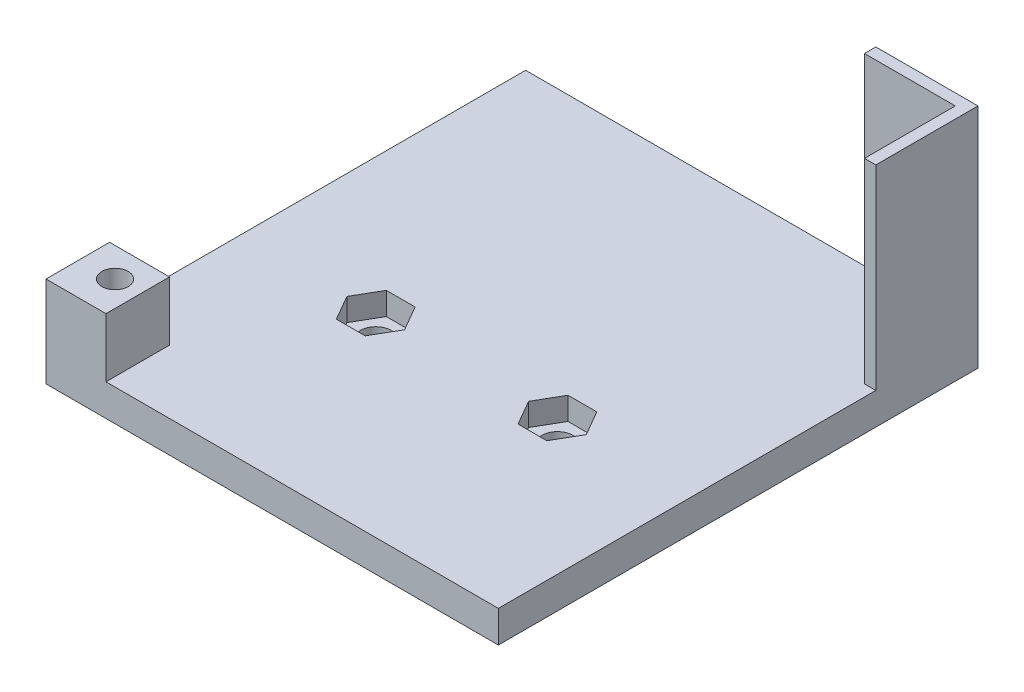
ISO-10303-21;
HEADER;
FILE_DESCRIPTION(('STEP AP214'),'2;1');
FILE_NAME('part.step','',(''),(''),'','','');
FILE_SCHEMA(('AUTOMOTIVE_DESIGN { 1 0 10303 214 1 1 1 1 }'));
ENDSEC;
DATA;
#1=APPLICATION_CONTEXT('core data for automotive mechanical design processes');
#2=APPLICATION_PROTOCOL_DEFINITION('international standard','automotive_design',2000,#1);
#3=PRODUCT_CONTEXT('',#1,'mechanical');
#4=PRODUCT('Part','Part','',(#3));
#5=PRODUCT_RELATED_PRODUCT_CATEGORY('part','',(#4));
#6=PRODUCT_DEFINITION_FORMATION('','',#4);
#7=PRODUCT_DEFINITION_CONTEXT('part definition',#1,'design');
#8=PRODUCT_DEFINITION('design','',#6,#7);
#9=PRODUCT_DEFINITION_SHAPE('','',#8);
#10=(LENGTH_UNIT() NAMED_UNIT(*) SI_UNIT(.MILLI.,.METRE.));
#11=(NAMED_UNIT(*) PLANE_ANGLE_UNIT() SI_UNIT($,.RADIAN.));
#12=(NAMED_UNIT(*) SI_UNIT($,.STERADIAN.) SOLID_ANGLE_UNIT());
#13=UNCERTAINTY_MEASURE_WITH_UNIT(LENGTH_MEASURE(1.E-05),#10,'distance_accuracy_value','');
#14=(GEOMETRIC_REPRESENTATION_CONTEXT(3) GLOBAL_UNCERTAINTY_ASSIGNED_CONTEXT((#13)) GLOBAL_UNIT_ASSIGNED_CONTEXT((#10,
#11,#12)) REPRESENTATION_CONTEXT('',''));
#15=CARTESIAN_POINT('',(0.,0.,0.));
#16=DIRECTION('',(0.,0.,1.));
#17=DIRECTION('',(1.,0.,0.));
#18=AXIS2_PLACEMENT_3D('',#15,#16,#17);
#19=CARTESIAN_POINT('',(10.,0.,5.));
#20=DIRECTION('',(0.,1.,0.));
#21=DIRECTION('',(0.,0.,1.));
#22=AXIS2_PLACEMENT_3D('',#19,#20,#21);
#23=CYLINDRICAL_SURFACE('',#22,1.7);
#24=CARTESIAN_POINT('',(10.,0.,5.));
#25=DIRECTION('',(0.,1.,0.));
#26=DIRECTION('',(0.,0.,1.));
#27=AXIS2_PLACEMENT_3D('',#24,#25,#26);
#28=CIRCLE('',#27,1.7);
#29=CARTESIAN_POINT('',(10.,0.,6.7));
#30=VERTEX_POINT('',#29);
#31=EDGE_CURVE('E247',#30,#30,#28,.T.);
#32=ORIENTED_EDGE('',*,*,#31,.F.);
#33=EDGE_LOOP('',(#32));
#34=FACE_BOUND('',#33,.T.);
#35=CARTESIAN_POINT('',(10.,1.,5.));
#36=DIRECTION('',(0.,1.,0.));
#37=DIRECTION('',(0.,0.,1.));
#38=AXIS2_PLACEMENT_3D('',#35,#36,#37);
#39=CIRCLE('',#38,1.7);
#40=CARTESIAN_POINT('',(10.,1.,6.7));
#41=VERTEX_POINT('',#40);
#42=EDGE_CURVE('E255',#41,#41,#39,.T.);
#43=ORIENTED_EDGE('',*,*,#42,.T.);
#44=EDGE_LOOP('',(#43));
#45=FACE_BOUND('',#44,.T.);
#46=ADVANCED_FACE('F37',(#34,#45),#23,.F.);
#47=CARTESIAN_POINT('',(-10.,0.,5.));
#48=DIRECTION('',(0.,1.,0.));
#49=DIRECTION('',(0.,0.,1.));
#50=AXIS2_PLACEMENT_3D('',#47,#48,#49);
#51=CYLINDRICAL_SURFACE('',#50,1.7);
#52=CARTESIAN_POINT('',(-10.,0.,5.));
#53=DIRECTION('',(0.,1.,0.));
#54=DIRECTION('',(0.,0.,1.));
#55=AXIS2_PLACEMENT_3D('',#52,#53,#54);
#56=CIRCLE('',#55,1.7);
#57=CARTESIAN_POINT('',(-10.,0.,6.7));
#58=VERTEX_POINT('',#57);
#59=EDGE_CURVE('E304',#58,#58,#56,.T.);
#60=ORIENTED_EDGE('',*,*,#59,.F.);
#61=EDGE_LOOP('',(#60));
#62=FACE_BOUND('',#61,.T.);
#63=CARTESIAN_POINT('',(-10.,1.,5.));
#64=DIRECTION('',(0.,1.,0.));
#65=DIRECTION('',(0.,0.,1.));
#66=AXIS2_PLACEMENT_3D('',#63,#64,#65);
#67=CIRCLE('',#66,1.7);
#68=CARTESIAN_POINT('',(-10.,1.,6.7));
#69=VERTEX_POINT('',#68);
#70=EDGE_CURVE('E225',#69,#69,#67,.T.);
#71=ORIENTED_EDGE('',*,*,#70,.T.);
#72=EDGE_LOOP('',(#71));
#73=FACE_BOUND('',#72,.T.);
#74=ADVANCED_FACE('F465',(#62,#73),#51,.F.);
#75=CARTESIAN_POINT('',(0.,3.5,26.4));
#76=DIRECTION('',(0.,0.,-1.));
#77=DIRECTION('',(-1.,0.,0.));
#78=AXIS2_PLACEMENT_3D('',#75,#76,#77);
#79=PLANE('',#78);
#80=DIRECTION('',(1.,0.,0.));
#81=VECTOR('',#80,1.);
#82=CARTESIAN_POINT('',(0.,0.,26.4));
#83=LINE('',#82,#81);
#84=CARTESIAN_POINT('',(-24.9,0.,26.4));
#85=VERTEX_POINT('',#84);
#86=CARTESIAN_POINT('',(24.9,0.,26.4));
#87=VERTEX_POINT('',#86);
#88=EDGE_CURVE('E369',#85,#87,#83,.T.);
#89=ORIENTED_EDGE('',*,*,#88,.T.);
#90=DIRECTION('',(0.,-1.,0.));
#91=VECTOR('',#90,1.);
#92=CARTESIAN_POINT('',(24.9,3.5,26.4));
#93=LINE('',#92,#91);
#94=CARTESIAN_POINT('',(24.9,3.5,26.4));
#95=VERTEX_POINT('',#94);
#96=EDGE_CURVE('E11',#95,#87,#93,.T.);
#97=ORIENTED_EDGE('',*,*,#96,.F.);
#98=DIRECTION('',(1.,0.,0.));
#99=VECTOR('',#98,1.);
#100=CARTESIAN_POINT('',(0.,3.5,26.4));
#101=LINE('',#100,#99);
#102=CARTESIAN_POINT('',(-18.2977272727273,3.5,26.4));
#103=VERTEX_POINT('',#102);
#104=EDGE_CURVE('E373',#103,#95,#101,.T.);
#105=ORIENTED_EDGE('',*,*,#104,.F.);
#106=DIRECTION('',(0.,-1.,0.));
#107=VECTOR('',#106,1.);
#108=CARTESIAN_POINT('',(-18.2977272727273,10.,26.4));
#109=LINE('',#108,#107);
#110=CARTESIAN_POINT('',(-18.2977272727273,10.,26.4));
#111=VERTEX_POINT('',#110);
#112=EDGE_CURVE('E335',#111,#103,#109,.T.);
#113=ORIENTED_EDGE('',*,*,#112,.F.);
#114=DIRECTION('',(1.,0.,0.));
#115=VECTOR('',#114,1.);
#116=CARTESIAN_POINT('',(0.,10.,26.4));
#117=LINE('',#116,#115);
#118=CARTESIAN_POINT('',(-24.9,10.,26.4));
#119=VERTEX_POINT('',#118);
#120=EDGE_CURVE('E313',#119,#111,#117,.T.);
#121=ORIENTED_EDGE('',*,*,#120,.F.);
#122=DIRECTION('',(0.,-1.,0.));
#123=VECTOR('',#122,1.);
#124=CARTESIAN_POINT('',(-24.9,10.,26.4));
#125=LINE('',#124,#123);
#126=EDGE_CURVE('E326',#119,#85,#125,.T.);
#127=ORIENTED_EDGE('',*,*,#126,.T.);
#128=EDGE_LOOP('',(#89,#97,#105,#113,#121,#127));
#129=FACE_BOUND('',#128,.T.);
#130=ADVANCED_FACE('F39',(#129),#79,.F.);
#131=CARTESIAN_POINT('',(24.9,3.5,0.));
#132=DIRECTION('',(-1.,0.,0.));
#133=DIRECTION('',(0.,0.,1.));
#134=AXIS2_PLACEMENT_3D('',#131,#132,#133);
#135=PLANE('',#134);
#136=DIRECTION('',(0.,0.,-1.));
#137=VECTOR('',#136,1.);
#138=CARTESIAN_POINT('',(24.9,0.,0.));
#139=LINE('',#138,#137);
#140=CARTESIAN_POINT('',(24.9,0.,-26.4));
#141=VERTEX_POINT('',#140);
#142=EDGE_CURVE('E396',#87,#141,#139,.T.);
#143=ORIENTED_EDGE('',*,*,#142,.T.);
#144=DIRECTION('',(0.,-1.,0.));
#145=VECTOR('',#144,1.);
#146=CARTESIAN_POINT('',(24.9,25.,-26.4));
#147=LINE('',#146,#145);
#148=CARTESIAN_POINT('',(24.9,25.,-26.4));
#149=VERTEX_POINT('',#148);
#150=EDGE_CURVE('E360',#149,#141,#147,.T.);
#151=ORIENTED_EDGE('',*,*,#150,.F.);
#152=DIRECTION('',(0.,0.,-1.));
#153=VECTOR('',#152,1.);
#154=CARTESIAN_POINT('',(24.9,25.,0.));
#155=LINE('',#154,#153);
#156=CARTESIAN_POINT('',(24.9,25.,-15.15));
#157=VERTEX_POINT('',#156);
#158=EDGE_CURVE('E343',#157,#149,#155,.T.);
#159=ORIENTED_EDGE('',*,*,#158,.F.);
#160=DIRECTION('',(0.,-1.,0.));
#161=VECTOR('',#160,1.);
#162=CARTESIAN_POINT('',(24.9,25.,-15.15));
#163=LINE('',#162,#161);
#164=CARTESIAN_POINT('',(24.9,3.5,-15.15));
#165=VERTEX_POINT('',#164);
#166=EDGE_CURVE('E363',#157,#165,#163,.T.);
#167=ORIENTED_EDGE('',*,*,#166,.T.);
#168=DIRECTION('',(0.,0.,-1.));
#169=VECTOR('',#168,1.);
#170=CARTESIAN_POINT('',(24.9,3.5,0.));
#171=LINE('',#170,#169);
#172=EDGE_CURVE('E376',#95,#165,#171,.T.);
#173=ORIENTED_EDGE('',*,*,#172,.F.);
#174=ORIENTED_EDGE('',*,*,#96,.T.);
#175=EDGE_LOOP('',(#143,#151,#159,#167,#173,#174));
#176=FACE_BOUND('',#175,.T.);
#177=ADVANCED_FACE('F418',(#176),#135,.F.);
#178=CARTESIAN_POINT('',(0.,3.5,-26.4));
#179=DIRECTION('',(0.,0.,-1.));
#180=DIRECTION('',(-1.,0.,0.));
#181=AXIS2_PLACEMENT_3D('',#178,#179,#180);
#182=PLANE('',#181);
#183=DIRECTION('',(1.,0.,0.));
#184=VECTOR('',#183,1.);
#185=CARTESIAN_POINT('',(0.,0.,-26.4));
#186=LINE('',#185,#184);
#187=CARTESIAN_POINT('',(-24.9,0.,-26.4));
#188=VERTEX_POINT('',#187);
#189=EDGE_CURVE('E398',#188,#141,#186,.T.);
#190=ORIENTED_EDGE('',*,*,#189,.F.);
#191=DIRECTION('',(0.,-1.,0.));
#192=VECTOR('',#191,1.);
#193=CARTESIAN_POINT('',(-24.9,3.5,-26.4));
#194=LINE('',#193,#192);
#195=CARTESIAN_POINT('',(-24.9,3.5,-26.4));
#196=VERTEX_POINT('',#195);
#197=EDGE_CURVE('E45',#196,#188,#194,.T.);
#198=ORIENTED_EDGE('',*,*,#197,.F.);
#199=DIRECTION('',(1.,0.,0.));
#200=VECTOR('',#199,1.);
#201=CARTESIAN_POINT('',(0.,3.5,-26.4));
#202=LINE('',#201,#200);
#203=CARTESIAN_POINT('',(13.65,3.5,-26.4));
#204=VERTEX_POINT('',#203);
#205=EDGE_CURVE('E387',#196,#204,#202,.T.);
#206=ORIENTED_EDGE('',*,*,#205,.T.);
#207=DIRECTION('',(0.,-1.,0.));
#208=VECTOR('',#207,1.);
#209=CARTESIAN_POINT('',(13.65,25.,-26.4));
#210=LINE('',#209,#208);
#211=CARTESIAN_POINT('',(13.65,25.,-26.4));
#212=VERTEX_POINT('',#211);
#213=EDGE_CURVE('E358',#212,#204,#210,.T.);
#214=ORIENTED_EDGE('',*,*,#213,.F.);
#215=DIRECTION('',(1.,0.,0.));
#216=VECTOR('',#215,1.);
#217=CARTESIAN_POINT('',(0.,25.,-26.4));
#218=LINE('',#217,#216);
#219=EDGE_CURVE('E345',#212,#149,#218,.T.);
#220=ORIENTED_EDGE('',*,*,#219,.T.);
#221=ORIENTED_EDGE('',*,*,#150,.T.);
#222=EDGE_LOOP('',(#190,#198,#206,#214,#220,#221));
#223=FACE_BOUND('',#222,.T.);
#224=ADVANCED_FACE('F408',(#223),#182,.T.);
#225=CARTESIAN_POINT('',(-24.9,3.5,0.));
#226=DIRECTION('',(-1.,0.,0.));
#227=DIRECTION('',(0.,0.,1.));
#228=AXIS2_PLACEMENT_3D('',#225,#226,#227);
#229=PLANE('',#228);
#230=DIRECTION('',(0.,0.,-1.));
#231=VECTOR('',#230,1.);
#232=CARTESIAN_POINT('',(-24.9,0.,0.));
#233=LINE('',#232,#231);
#234=EDGE_CURVE('E374',#85,#188,#233,.T.);
#235=ORIENTED_EDGE('',*,*,#234,.F.);
#236=ORIENTED_EDGE('',*,*,#126,.F.);
#237=DIRECTION('',(0.,0.,-1.));
#238=VECTOR('',#237,1.);
#239=CARTESIAN_POINT('',(-24.9,10.,0.));
#240=LINE('',#239,#238);
#241=CARTESIAN_POINT('',(-24.9,10.,19.4));
#242=VERTEX_POINT('',#241);
#243=EDGE_CURVE('E323',#119,#242,#240,.T.);
#244=ORIENTED_EDGE('',*,*,#243,.T.);
#245=DIRECTION('',(0.,-1.,0.));
#246=VECTOR('',#245,1.);
#247=CARTESIAN_POINT('',(-24.9,10.,19.4));
#248=LINE('',#247,#246);
#249=CARTESIAN_POINT('',(-24.9,3.5,19.4));
#250=VERTEX_POINT('',#249);
#251=EDGE_CURVE('E329',#242,#250,#248,.T.);
#252=ORIENTED_EDGE('',*,*,#251,.T.);
#253=DIRECTION('',(0.,0.,-1.));
#254=VECTOR('',#253,1.);
#255=CARTESIAN_POINT('',(-24.9,3.5,0.));
#256=LINE('',#255,#254);
#257=EDGE_CURVE('E390',#250,#196,#256,.T.);
#258=ORIENTED_EDGE('',*,*,#257,.T.);
#259=ORIENTED_EDGE('',*,*,#197,.T.);
#260=EDGE_LOOP('',(#235,#236,#244,#252,#258,#259));
#261=FACE_BOUND('',#260,.T.);
#262=ADVANCED_FACE('F405',(#261),#229,.T.);
#263=CARTESIAN_POINT('',(0.,3.5,0.));
#264=DIRECTION('',(0.,1.,0.));
#265=DIRECTION('',(0.,0.,1.));
#266=AXIS2_PLACEMENT_3D('',#263,#264,#265);
#267=PLANE('',#266);
#268=DIRECTION('',(0.499999999999999,0.,-0.866025403784439));
#269=VECTOR('',#268,1.);
#270=CARTESIAN_POINT('',(-8.41228675972853,3.5,7.75));
#271=LINE('',#270,#269);
#272=CARTESIAN_POINT('',(-8.41228675972853,3.5,7.75));
#273=VERTEX_POINT('',#272);
#274=CARTESIAN_POINT('',(-6.82457351945706,3.5,5.));
#275=VERTEX_POINT('',#274);
#276=EDGE_CURVE('E52',#273,#275,#271,.T.);
#277=ORIENTED_EDGE('',*,*,#276,.F.);
#278=DIRECTION('',(1.,0.,0.));
#279=VECTOR('',#278,1.);
#280=CARTESIAN_POINT('',(-11.5877132402715,3.5,7.75));
#281=LINE('',#280,#279);
#282=CARTESIAN_POINT('',(-11.5877132402715,3.5,7.75));
#283=VERTEX_POINT('',#282);
#284=EDGE_CURVE('E219',#283,#273,#281,.T.);
#285=ORIENTED_EDGE('',*,*,#284,.F.);
#286=DIRECTION('',(0.500000000000001,0.,0.866025403784438));
#287=VECTOR('',#286,1.);
#288=CARTESIAN_POINT('',(-13.1754264805429,3.5,5.00000000000001));
#289=LINE('',#288,#287);
#290=CARTESIAN_POINT('',(-13.1754264805429,3.5,5.00000000000001));
#291=VERTEX_POINT('',#290);
#292=EDGE_CURVE('E222',#291,#283,#289,.T.);
#293=ORIENTED_EDGE('',*,*,#292,.F.);
#294=DIRECTION('',(-0.5,0.,0.866025403784439));
#295=VECTOR('',#294,1.);
#296=CARTESIAN_POINT('',(-11.5877132402715,3.5,2.25));
#297=LINE('',#296,#295);
#298=CARTESIAN_POINT('',(-11.5877132402715,3.5,2.25));
#299=VERTEX_POINT('',#298);
#300=EDGE_CURVE('E240',#299,#291,#297,.T.);
#301=ORIENTED_EDGE('',*,*,#300,.F.);
#302=DIRECTION('',(-1.,0.,0.));
#303=VECTOR('',#302,1.);
#304=CARTESIAN_POINT('',(-8.41228675972853,3.5,2.25));
#305=LINE('',#304,#303);
#306=CARTESIAN_POINT('',(-8.41228675972853,3.5,2.25));
#307=VERTEX_POINT('',#306);
#308=EDGE_CURVE('E237',#307,#299,#305,.T.);
#309=ORIENTED_EDGE('',*,*,#308,.F.);
#310=DIRECTION('',(-0.5,0.,-0.866025403784439));
#311=VECTOR('',#310,1.);
#312=CARTESIAN_POINT('',(-6.82457351945706,3.5,5.));
#313=LINE('',#312,#311);
#314=EDGE_CURVE('E235',#275,#307,#313,.T.);
#315=ORIENTED_EDGE('',*,*,#314,.F.);
#316=EDGE_LOOP('',(#277,#285,#293,#301,#309,#315));
#317=FACE_BOUND('',#316,.T.);
#318=DIRECTION('',(0.5,0.,-0.866025403784439));
#319=VECTOR('',#318,1.);
#320=CARTESIAN_POINT('',(11.5877132402715,3.5,7.75));
#321=LINE('',#320,#319);
#322=CARTESIAN_POINT('',(11.5877132402715,3.5,7.75));
#323=VERTEX_POINT('',#322);
#324=CARTESIAN_POINT('',(13.1754264805429,3.5,5.));
#325=VERTEX_POINT('',#324);
#326=EDGE_CURVE('E60',#323,#325,#321,.T.);
#327=ORIENTED_EDGE('',*,*,#326,.F.);
#328=DIRECTION('',(1.,0.,0.));
#329=VECTOR('',#328,1.);
#330=CARTESIAN_POINT('',(8.41228675972853,3.5,7.75));
#331=LINE('',#330,#329);
#332=CARTESIAN_POINT('',(8.41228675972853,3.5,7.75));
#333=VERTEX_POINT('',#332);
#334=EDGE_CURVE('E262',#333,#323,#331,.T.);
#335=ORIENTED_EDGE('',*,*,#334,.F.);
#336=DIRECTION('',(0.5,0.,0.866025403784439));
#337=VECTOR('',#336,1.);
#338=CARTESIAN_POINT('',(6.82457351945706,3.5,5.));
#339=LINE('',#338,#337);
#340=CARTESIAN_POINT('',(6.82457351945706,3.5,5.));
#341=VERTEX_POINT('',#340);
#342=EDGE_CURVE('E288',#341,#333,#339,.T.);
#343=ORIENTED_EDGE('',*,*,#342,.F.);
#344=DIRECTION('',(-0.5,0.,0.866025403784439));
#345=VECTOR('',#344,1.);
#346=CARTESIAN_POINT('',(8.41228675972853,3.5,2.25));
#347=LINE('',#346,#345);
#348=CARTESIAN_POINT('',(8.41228675972853,3.5,2.25));
#349=VERTEX_POINT('',#348);
#350=EDGE_CURVE('E285',#349,#341,#347,.T.);
#351=ORIENTED_EDGE('',*,*,#350,.F.);
#352=DIRECTION('',(-1.,0.,0.));
#353=VECTOR('',#352,1.);
#354=CARTESIAN_POINT('',(11.5877132402715,3.5,2.25));
#355=LINE('',#354,#353);
#356=CARTESIAN_POINT('',(11.5877132402715,3.5,2.25));
#357=VERTEX_POINT('',#356);
#358=EDGE_CURVE('E282',#357,#349,#355,.T.);
#359=ORIENTED_EDGE('',*,*,#358,.F.);
#360=DIRECTION('',(-0.5,0.,-0.866025403784439));
#361=VECTOR('',#360,1.);
#362=CARTESIAN_POINT('',(13.1754264805429,3.5,5.));
#363=LINE('',#362,#361);
#364=EDGE_CURVE('E279',#325,#357,#363,.T.);
#365=ORIENTED_EDGE('',*,*,#364,.F.);
#366=EDGE_LOOP('',(#327,#335,#343,#351,#359,#365));
#367=FACE_BOUND('',#366,.T.);
#368=DIRECTION('',(0.,0.,-1.));
#369=VECTOR('',#368,1.);
#370=CARTESIAN_POINT('',(-18.2977272727273,3.5,0.));
#371=LINE('',#370,#369);
#372=CARTESIAN_POINT('',(-18.2977272727273,3.5,19.4));
#373=VERTEX_POINT('',#372);
#374=EDGE_CURVE('E370',#103,#373,#371,.T.);
#375=ORIENTED_EDGE('',*,*,#374,.F.);
#376=ORIENTED_EDGE('',*,*,#104,.T.);
#377=ORIENTED_EDGE('',*,*,#172,.T.);
#378=DIRECTION('',(1.,0.,0.));
#379=VECTOR('',#378,1.);
#380=CARTESIAN_POINT('',(0.,3.5,-15.15));
#381=LINE('',#380,#379);
#382=CARTESIAN_POINT('',(23.65,3.5,-15.15));
#383=VERTEX_POINT('',#382);
#384=EDGE_CURVE('E379',#383,#165,#381,.T.);
#385=ORIENTED_EDGE('',*,*,#384,.F.);
#386=DIRECTION('',(0.,0.,1.));
#387=VECTOR('',#386,1.);
#388=CARTESIAN_POINT('',(23.65,3.5,0.));
#389=LINE('',#388,#387);
#390=CARTESIAN_POINT('',(23.65,3.5,-25.15));
#391=VERTEX_POINT('',#390);
#392=EDGE_CURVE('E381',#391,#383,#389,.T.);
#393=ORIENTED_EDGE('',*,*,#392,.F.);
#394=DIRECTION('',(1.,0.,0.));
#395=VECTOR('',#394,1.);
#396=CARTESIAN_POINT('',(0.,3.5,-25.15));
#397=LINE('',#396,#395);
#398=CARTESIAN_POINT('',(13.65,3.5,-25.15));
#399=VERTEX_POINT('',#398);
#400=EDGE_CURVE('E383',#399,#391,#397,.T.);
#401=ORIENTED_EDGE('',*,*,#400,.F.);
#402=DIRECTION('',(0.,0.,1.));
#403=VECTOR('',#402,1.);
#404=CARTESIAN_POINT('',(13.65,3.5,0.));
#405=LINE('',#404,#403);
#406=EDGE_CURVE('E385',#204,#399,#405,.T.);
#407=ORIENTED_EDGE('',*,*,#406,.F.);
#408=ORIENTED_EDGE('',*,*,#205,.F.);
#409=ORIENTED_EDGE('',*,*,#257,.F.);
#410=DIRECTION('',(1.,0.,0.));
#411=VECTOR('',#410,1.);
#412=CARTESIAN_POINT('',(0.,3.5,19.4));
#413=LINE('',#412,#411);
#414=EDGE_CURVE('E393',#250,#373,#413,.T.);
#415=ORIENTED_EDGE('',*,*,#414,.T.);
#416=EDGE_LOOP('',(#375,#376,#377,#385,#393,#401,#407,#408,#409,#415));
#417=FACE_BOUND('',#416,.T.);
#418=ADVANCED_FACE('F424',(#317,#367,#417),#267,.T.);
#419=CARTESIAN_POINT('',(0.,0.,0.));
#420=DIRECTION('',(0.,1.,0.));
#421=DIRECTION('',(0.,0.,1.));
#422=AXIS2_PLACEMENT_3D('',#419,#420,#421);
#423=PLANE('',#422);
#424=ORIENTED_EDGE('',*,*,#59,.T.);
#425=EDGE_LOOP('',(#424));
#426=FACE_BOUND('',#425,.T.);
#427=ORIENTED_EDGE('',*,*,#31,.T.);
#428=EDGE_LOOP('',(#427));
#429=FACE_BOUND('',#428,.T.);
#430=CARTESIAN_POINT('',(-21.1,0.,22.6));
#431=DIRECTION('',(0.,1.,0.));
#432=DIRECTION('',(0.,0.,1.));
#433=AXIS2_PLACEMENT_3D('',#430,#431,#432);
#434=CIRCLE('',#433,1.45);
#435=CARTESIAN_POINT('',(-21.1,0.,24.05));
#436=VERTEX_POINT('',#435);
#437=EDGE_CURVE('E310',#436,#436,#434,.T.);
#438=ORIENTED_EDGE('',*,*,#437,.T.);
#439=EDGE_LOOP('',(#438));
#440=FACE_BOUND('',#439,.T.);
#441=ORIENTED_EDGE('',*,*,#189,.T.);
#442=ORIENTED_EDGE('',*,*,#142,.F.);
#443=ORIENTED_EDGE('',*,*,#88,.F.);
#444=ORIENTED_EDGE('',*,*,#234,.T.);
#445=EDGE_LOOP('',(#441,#442,#443,#444));
#446=FACE_BOUND('',#445,.T.);
#447=ADVANCED_FACE('F412',(#426,#429,#440,#446),#423,.F.);
#448=CARTESIAN_POINT('',(23.65,25.,0.));
#449=DIRECTION('',(1.,0.,0.));
#450=DIRECTION('',(0.,0.,-1.));
#451=AXIS2_PLACEMENT_3D('',#448,#449,#450);
#452=PLANE('',#451);
#453=ORIENTED_EDGE('',*,*,#392,.T.);
#454=DIRECTION('',(0.,-1.,0.));
#455=VECTOR('',#454,1.);
#456=CARTESIAN_POINT('',(23.65,25.,-15.15));
#457=LINE('',#456,#455);
#458=CARTESIAN_POINT('',(23.65,25.,-15.15));
#459=VERTEX_POINT('',#458);
#460=EDGE_CURVE('E366',#459,#383,#457,.T.);
#461=ORIENTED_EDGE('',*,*,#460,.F.);
#462=DIRECTION('',(0.,0.,1.));
#463=VECTOR('',#462,1.);
#464=CARTESIAN_POINT('',(23.65,25.,0.));
#465=LINE('',#464,#463);
#466=CARTESIAN_POINT('',(23.65,25.,-25.15));
#467=VERTEX_POINT('',#466);
#468=EDGE_CURVE('E338',#467,#459,#465,.T.);
#469=ORIENTED_EDGE('',*,*,#468,.F.);
#470=DIRECTION('',(0.,-1.,0.));
#471=VECTOR('',#470,1.);
#472=CARTESIAN_POINT('',(23.65,25.,-25.15));
#473=LINE('',#472,#471);
#474=EDGE_CURVE('E352',#467,#391,#473,.T.);
#475=ORIENTED_EDGE('',*,*,#474,.T.);
#476=EDGE_LOOP('',(#453,#461,#469,#475));
#477=FACE_BOUND('',#476,.T.);
#478=ADVANCED_FACE('F452',(#477),#452,.F.);
#479=CARTESIAN_POINT('',(0.,25.,-15.15));
#480=DIRECTION('',(0.,0.,-1.));
#481=DIRECTION('',(-1.,0.,0.));
#482=AXIS2_PLACEMENT_3D('',#479,#480,#481);
#483=PLANE('',#482);
#484=ORIENTED_EDGE('',*,*,#384,.T.);
#485=ORIENTED_EDGE('',*,*,#166,.F.);
#486=DIRECTION('',(1.,0.,0.));
#487=VECTOR('',#486,1.);
#488=CARTESIAN_POINT('',(0.,25.,-15.15));
#489=LINE('',#488,#487);
#490=EDGE_CURVE('E341',#459,#157,#489,.T.);
#491=ORIENTED_EDGE('',*,*,#490,.F.);
#492=ORIENTED_EDGE('',*,*,#460,.T.);
#493=EDGE_LOOP('',(#484,#485,#491,#492));
#494=FACE_BOUND('',#493,.T.);
#495=ADVANCED_FACE('F450',(#494),#483,.F.);
#496=CARTESIAN_POINT('',(13.65,25.,0.));
#497=DIRECTION('',(1.,0.,0.));
#498=DIRECTION('',(0.,0.,-1.));
#499=AXIS2_PLACEMENT_3D('',#496,#497,#498);
#500=PLANE('',#499);
#501=ORIENTED_EDGE('',*,*,#406,.T.);
#502=DIRECTION('',(0.,-1.,0.));
#503=VECTOR('',#502,1.);
#504=CARTESIAN_POINT('',(13.65,25.,-25.15));
#505=LINE('',#504,#503);
#506=CARTESIAN_POINT('',(13.65,25.,-25.15));
#507=VERTEX_POINT('',#506);
#508=EDGE_CURVE('E355',#507,#399,#505,.T.);
#509=ORIENTED_EDGE('',*,*,#508,.F.);
#510=DIRECTION('',(0.,0.,1.));
#511=VECTOR('',#510,1.);
#512=CARTESIAN_POINT('',(13.65,25.,0.));
#513=LINE('',#512,#511);
#514=EDGE_CURVE('E348',#212,#507,#513,.T.);
#515=ORIENTED_EDGE('',*,*,#514,.F.);
#516=ORIENTED_EDGE('',*,*,#213,.T.);
#517=EDGE_LOOP('',(#501,#509,#515,#516));
#518=FACE_BOUND('',#517,.T.);
#519=ADVANCED_FACE('F443',(#518),#500,.F.);
#520=CARTESIAN_POINT('',(0.,25.,-25.15));
#521=DIRECTION('',(0.,0.,-1.));
#522=DIRECTION('',(-1.,0.,0.));
#523=AXIS2_PLACEMENT_3D('',#520,#521,#522);
#524=PLANE('',#523);
#525=ORIENTED_EDGE('',*,*,#400,.T.);
#526=ORIENTED_EDGE('',*,*,#474,.F.);
#527=DIRECTION('',(1.,0.,0.));
#528=VECTOR('',#527,1.);
#529=CARTESIAN_POINT('',(0.,25.,-25.15));
#530=LINE('',#529,#528);
#531=EDGE_CURVE('E350',#507,#467,#530,.T.);
#532=ORIENTED_EDGE('',*,*,#531,.F.);
#533=ORIENTED_EDGE('',*,*,#508,.T.);
#534=EDGE_LOOP('',(#525,#526,#532,#533));
#535=FACE_BOUND('',#534,.T.);
#536=ADVANCED_FACE('F455',(#535),#524,.F.);
#537=CARTESIAN_POINT('',(0.,25.,0.));
#538=DIRECTION('',(0.,1.,0.));
#539=DIRECTION('',(0.,0.,1.));
#540=AXIS2_PLACEMENT_3D('',#537,#538,#539);
#541=PLANE('',#540);
#542=ORIENTED_EDGE('',*,*,#468,.T.);
#543=ORIENTED_EDGE('',*,*,#490,.T.);
#544=ORIENTED_EDGE('',*,*,#158,.T.);
#545=ORIENTED_EDGE('',*,*,#219,.F.);
#546=ORIENTED_EDGE('',*,*,#514,.T.);
#547=ORIENTED_EDGE('',*,*,#531,.T.);
#548=EDGE_LOOP('',(#542,#543,#544,#545,#546,#547));
#549=FACE_BOUND('',#548,.T.);
#550=ADVANCED_FACE('F446',(#549),#541,.T.);
#551=CARTESIAN_POINT('',(-18.2977272727273,10.,0.));
#552=DIRECTION('',(-1.,0.,0.));
#553=DIRECTION('',(0.,0.,1.));
#554=AXIS2_PLACEMENT_3D('',#551,#552,#553);
#555=PLANE('',#554);
#556=ORIENTED_EDGE('',*,*,#374,.T.);
#557=DIRECTION('',(0.,-1.,0.));
#558=VECTOR('',#557,1.);
#559=CARTESIAN_POINT('',(-18.2977272727273,10.,19.4));
#560=LINE('',#559,#558);
#561=CARTESIAN_POINT('',(-18.2977272727273,10.,19.4));
#562=VERTEX_POINT('',#561);
#563=EDGE_CURVE('E332',#562,#373,#560,.T.);
#564=ORIENTED_EDGE('',*,*,#563,.F.);
#565=DIRECTION('',(0.,0.,-1.));
#566=VECTOR('',#565,1.);
#567=CARTESIAN_POINT('',(-18.2977272727273,10.,0.));
#568=LINE('',#567,#566);
#569=EDGE_CURVE('E318',#111,#562,#568,.T.);
#570=ORIENTED_EDGE('',*,*,#569,.F.);
#571=ORIENTED_EDGE('',*,*,#112,.T.);
#572=EDGE_LOOP('',(#556,#564,#570,#571));
#573=FACE_BOUND('',#572,.T.);
#574=ADVANCED_FACE('F429',(#573),#555,.F.);
#575=CARTESIAN_POINT('',(0.,10.,19.4));
#576=DIRECTION('',(0.,0.,-1.));
#577=DIRECTION('',(-1.,0.,0.));
#578=AXIS2_PLACEMENT_3D('',#575,#576,#577);
#579=PLANE('',#578);
#580=ORIENTED_EDGE('',*,*,#563,.T.);
#581=ORIENTED_EDGE('',*,*,#414,.F.);
#582=ORIENTED_EDGE('',*,*,#251,.F.);
#583=DIRECTION('',(1.,0.,0.));
#584=VECTOR('',#583,1.);
#585=CARTESIAN_POINT('',(0.,10.,19.4));
#586=LINE('',#585,#584);
#587=EDGE_CURVE('E320',#242,#562,#586,.T.);
#588=ORIENTED_EDGE('',*,*,#587,.T.);
#589=EDGE_LOOP('',(#580,#581,#582,#588));
#590=FACE_BOUND('',#589,.T.);
#591=ADVANCED_FACE('F436',(#590),#579,.T.);
#592=CARTESIAN_POINT('',(0.,10.,0.));
#593=DIRECTION('',(0.,1.,0.));
#594=DIRECTION('',(0.,0.,1.));
#595=AXIS2_PLACEMENT_3D('',#592,#593,#594);
#596=PLANE('',#595);
#597=CARTESIAN_POINT('',(-21.1,10.,22.6));
#598=DIRECTION('',(0.,1.,0.));
#599=DIRECTION('',(0.,0.,1.));
#600=AXIS2_PLACEMENT_3D('',#597,#598,#599);
#601=CIRCLE('',#600,1.45);
#602=CARTESIAN_POINT('',(-21.1,10.,24.05));
#603=VERTEX_POINT('',#602);
#604=EDGE_CURVE('E307',#603,#603,#601,.T.);
#605=ORIENTED_EDGE('',*,*,#604,.F.);
#606=EDGE_LOOP('',(#605));
#607=FACE_BOUND('',#606,.T.);
#608=ORIENTED_EDGE('',*,*,#120,.T.);
#609=ORIENTED_EDGE('',*,*,#569,.T.);
#610=ORIENTED_EDGE('',*,*,#587,.F.);
#611=ORIENTED_EDGE('',*,*,#243,.F.);
#612=EDGE_LOOP('',(#608,#609,#610,#611));
#613=FACE_BOUND('',#612,.T.);
#614=ADVANCED_FACE('F433',(#607,#613),#596,.T.);
#615=CARTESIAN_POINT('',(-21.1,0.,22.6));
#616=DIRECTION('',(0.,1.,0.));
#617=DIRECTION('',(0.,0.,1.));
#618=AXIS2_PLACEMENT_3D('',#615,#616,#617);
#619=CYLINDRICAL_SURFACE('',#618,1.45);
#620=ORIENTED_EDGE('',*,*,#437,.F.);
#621=EDGE_LOOP('',(#620));
#622=FACE_BOUND('',#621,.T.);
#623=ORIENTED_EDGE('',*,*,#604,.T.);
#624=EDGE_LOOP('',(#623));
#625=FACE_BOUND('',#624,.T.);
#626=ADVANCED_FACE('F477',(#622,#625),#619,.F.);
#627=CARTESIAN_POINT('',(-8.41228675972853,1.,7.75));
#628=DIRECTION('',(0.866025403784439,0.,0.499999999999999));
#629=DIRECTION('',(0.499999999999999,0.,-0.866025403784439));
#630=AXIS2_PLACEMENT_3D('',#627,#628,#629);
#631=PLANE('',#630);
#632=ORIENTED_EDGE('',*,*,#276,.T.);
#633=DIRECTION('',(0.,1.,0.));
#634=VECTOR('',#633,1.);
#635=CARTESIAN_POINT('',(-6.82457351945706,1.,5.));
#636=LINE('',#635,#634);
#637=CARTESIAN_POINT('',(-6.82457351945706,1.,5.));
#638=VERTEX_POINT('',#637);
#639=EDGE_CURVE('E196',#638,#275,#636,.T.);
#640=ORIENTED_EDGE('',*,*,#639,.F.);
#641=DIRECTION('',(0.499999999999999,0.,-0.866025403784439));
#642=VECTOR('',#641,1.);
#643=CARTESIAN_POINT('',(-8.41228675972853,1.,7.75));
#644=LINE('',#643,#642);
#645=CARTESIAN_POINT('',(-8.41228675972853,1.,7.75));
#646=VERTEX_POINT('',#645);
#647=EDGE_CURVE('E200',#646,#638,#644,.T.);
#648=ORIENTED_EDGE('',*,*,#647,.F.);
#649=DIRECTION('',(0.,1.,0.));
#650=VECTOR('',#649,1.);
#651=CARTESIAN_POINT('',(-8.41228675972853,1.,7.75));
#652=LINE('',#651,#650);
#653=EDGE_CURVE('E245',#646,#273,#652,.T.);
#654=ORIENTED_EDGE('',*,*,#653,.T.);
#655=EDGE_LOOP('',(#632,#640,#648,#654));
#656=FACE_BOUND('',#655,.T.);
#657=ADVANCED_FACE('F198',(#656),#631,.F.);
#658=CARTESIAN_POINT('',(-11.5877132402715,1.,7.75));
#659=DIRECTION('',(0.,0.,1.));
#660=DIRECTION('',(1.,0.,0.));
#661=AXIS2_PLACEMENT_3D('',#658,#659,#660);
#662=PLANE('',#661);
#663=ORIENTED_EDGE('',*,*,#284,.T.);
#664=ORIENTED_EDGE('',*,*,#653,.F.);
#665=DIRECTION('',(1.,0.,0.));
#666=VECTOR('',#665,1.);
#667=CARTESIAN_POINT('',(-11.5877132402715,1.,7.75));
#668=LINE('',#667,#666);
#669=CARTESIAN_POINT('',(-11.5877132402715,1.,7.75));
#670=VERTEX_POINT('',#669);
#671=EDGE_CURVE('E206',#670,#646,#668,.T.);
#672=ORIENTED_EDGE('',*,*,#671,.F.);
#673=DIRECTION('',(0.,1.,0.));
#674=VECTOR('',#673,1.);
#675=CARTESIAN_POINT('',(-11.5877132402715,1.,7.75));
#676=LINE('',#675,#674);
#677=EDGE_CURVE('E248',#670,#283,#676,.T.);
#678=ORIENTED_EDGE('',*,*,#677,.T.);
#679=EDGE_LOOP('',(#663,#664,#672,#678));
#680=FACE_BOUND('',#679,.T.);
#681=ADVANCED_FACE('F511',(#680),#662,.F.);
#682=CARTESIAN_POINT('',(-13.1754264805429,1.,5.00000000000001));
#683=DIRECTION('',(-0.866025403784438,0.,0.500000000000001));
#684=DIRECTION('',(0.500000000000001,0.,0.866025403784438));
#685=AXIS2_PLACEMENT_3D('',#682,#683,#684);
#686=PLANE('',#685);
#687=ORIENTED_EDGE('',*,*,#292,.T.);
#688=ORIENTED_EDGE('',*,*,#677,.F.);
#689=DIRECTION('',(0.500000000000001,0.,0.866025403784438));
#690=VECTOR('',#689,1.);
#691=CARTESIAN_POINT('',(-13.1754264805429,1.,5.00000000000001));
#692=LINE('',#691,#690);
#693=CARTESIAN_POINT('',(-13.1754264805429,1.,5.00000000000001));
#694=VERTEX_POINT('',#693);
#695=EDGE_CURVE('E231',#694,#670,#692,.T.);
#696=ORIENTED_EDGE('',*,*,#695,.F.);
#697=DIRECTION('',(0.,1.,0.));
#698=VECTOR('',#697,1.);
#699=CARTESIAN_POINT('',(-13.1754264805429,1.,5.00000000000001));
#700=LINE('',#699,#698);
#701=EDGE_CURVE('E250',#694,#291,#700,.T.);
#702=ORIENTED_EDGE('',*,*,#701,.T.);
#703=EDGE_LOOP('',(#687,#688,#696,#702));
#704=FACE_BOUND('',#703,.T.);
#705=ADVANCED_FACE('F519',(#704),#686,.F.);
#706=CARTESIAN_POINT('',(-11.5877132402715,1.,2.25));
#707=DIRECTION('',(-0.866025403784439,0.,-0.5));
#708=DIRECTION('',(-0.5,0.,0.866025403784439));
#709=AXIS2_PLACEMENT_3D('',#706,#707,#708);
#710=PLANE('',#709);
#711=ORIENTED_EDGE('',*,*,#300,.T.);
#712=ORIENTED_EDGE('',*,*,#701,.F.);
#713=DIRECTION('',(-0.5,0.,0.866025403784439));
#714=VECTOR('',#713,1.);
#715=CARTESIAN_POINT('',(-11.5877132402715,1.,2.25));
#716=LINE('',#715,#714);
#717=CARTESIAN_POINT('',(-11.5877132402715,1.,2.25));
#718=VERTEX_POINT('',#717);
#719=EDGE_CURVE('E228',#718,#694,#716,.T.);
#720=ORIENTED_EDGE('',*,*,#719,.F.);
#721=DIRECTION('',(0.,1.,0.));
#722=VECTOR('',#721,1.);
#723=CARTESIAN_POINT('',(-11.5877132402715,1.,2.25));
#724=LINE('',#723,#722);
#725=EDGE_CURVE('E252',#718,#299,#724,.T.);
#726=ORIENTED_EDGE('',*,*,#725,.T.);
#727=EDGE_LOOP('',(#711,#712,#720,#726));
#728=FACE_BOUND('',#727,.T.);
#729=ADVANCED_FACE('F527',(#728),#710,.F.);
#730=CARTESIAN_POINT('',(-8.41228675972853,1.,2.25));
#731=DIRECTION('',(0.,0.,-1.));
#732=DIRECTION('',(-1.,0.,0.));
#733=AXIS2_PLACEMENT_3D('',#730,#731,#732);
#734=PLANE('',#733);
#735=ORIENTED_EDGE('',*,*,#308,.T.);
#736=ORIENTED_EDGE('',*,*,#725,.F.);
#737=DIRECTION('',(-1.,0.,0.));
#738=VECTOR('',#737,1.);
#739=CARTESIAN_POINT('',(-8.41228675972853,1.,2.25));
#740=LINE('',#739,#738);
#741=CARTESIAN_POINT('',(-8.41228675972853,1.,2.25));
#742=VERTEX_POINT('',#741);
#743=EDGE_CURVE('E214',#742,#718,#740,.T.);
#744=ORIENTED_EDGE('',*,*,#743,.F.);
#745=DIRECTION('',(0.,1.,0.));
#746=VECTOR('',#745,1.);
#747=CARTESIAN_POINT('',(-8.41228675972853,1.,2.25));
#748=LINE('',#747,#746);
#749=EDGE_CURVE('E205',#742,#307,#748,.T.);
#750=ORIENTED_EDGE('',*,*,#749,.T.);
#751=EDGE_LOOP('',(#735,#736,#744,#750));
#752=FACE_BOUND('',#751,.T.);
#753=ADVANCED_FACE('F535',(#752),#734,.F.);
#754=CARTESIAN_POINT('',(-6.82457351945706,1.,5.));
#755=DIRECTION('',(0.866025403784438,0.,-0.5));
#756=DIRECTION('',(-0.5,0.,-0.866025403784439));
#757=AXIS2_PLACEMENT_3D('',#754,#755,#756);
#758=PLANE('',#757);
#759=ORIENTED_EDGE('',*,*,#314,.T.);
#760=ORIENTED_EDGE('',*,*,#749,.F.);
#761=DIRECTION('',(-0.5,0.,-0.866025403784439));
#762=VECTOR('',#761,1.);
#763=CARTESIAN_POINT('',(-6.82457351945706,1.,5.));
#764=LINE('',#763,#762);
#765=EDGE_CURVE('E209',#638,#742,#764,.T.);
#766=ORIENTED_EDGE('',*,*,#765,.F.);
#767=ORIENTED_EDGE('',*,*,#639,.T.);
#768=EDGE_LOOP('',(#759,#760,#766,#767));
#769=FACE_BOUND('',#768,.T.);
#770=ADVANCED_FACE('F210',(#769),#758,.F.);
#771=CARTESIAN_POINT('',(0.,1.,0.));
#772=DIRECTION('',(0.,1.,0.));
#773=DIRECTION('',(0.,0.,1.));
#774=AXIS2_PLACEMENT_3D('',#771,#772,#773);
#775=PLANE('',#774);
#776=ORIENTED_EDGE('',*,*,#70,.F.);
#777=EDGE_LOOP('',(#776));
#778=FACE_BOUND('',#777,.T.);
#779=ORIENTED_EDGE('',*,*,#647,.T.);
#780=ORIENTED_EDGE('',*,*,#765,.T.);
#781=ORIENTED_EDGE('',*,*,#743,.T.);
#782=ORIENTED_EDGE('',*,*,#719,.T.);
#783=ORIENTED_EDGE('',*,*,#695,.T.);
#784=ORIENTED_EDGE('',*,*,#671,.T.);
#785=EDGE_LOOP('',(#779,#780,#781,#782,#783,#784));
#786=FACE_BOUND('',#785,.T.);
#787=ADVANCED_FACE('F216',(#778,#786),#775,.T.);
#788=CARTESIAN_POINT('',(11.5877132402715,1.,7.75));
#789=DIRECTION('',(0.866025403784439,0.,0.5));
#790=DIRECTION('',(0.5,0.,-0.866025403784439));
#791=AXIS2_PLACEMENT_3D('',#788,#789,#790);
#792=PLANE('',#791);
#793=ORIENTED_EDGE('',*,*,#326,.T.);
#794=DIRECTION('',(0.,1.,0.));
#795=VECTOR('',#794,1.);
#796=CARTESIAN_POINT('',(13.1754264805429,1.,5.));
#797=LINE('',#796,#795);
#798=CARTESIAN_POINT('',(13.1754264805429,1.,5.));
#799=VERTEX_POINT('',#798);
#800=EDGE_CURVE('E277',#799,#325,#797,.T.);
#801=ORIENTED_EDGE('',*,*,#800,.F.);
#802=DIRECTION('',(0.5,0.,-0.866025403784439));
#803=VECTOR('',#802,1.);
#804=CARTESIAN_POINT('',(11.5877132402715,1.,7.75));
#805=LINE('',#804,#803);
#806=CARTESIAN_POINT('',(11.5877132402715,1.,7.75));
#807=VERTEX_POINT('',#806);
#808=EDGE_CURVE('E258',#807,#799,#805,.T.);
#809=ORIENTED_EDGE('',*,*,#808,.F.);
#810=DIRECTION('',(0.,1.,0.));
#811=VECTOR('',#810,1.);
#812=CARTESIAN_POINT('',(11.5877132402715,1.,7.75));
#813=LINE('',#812,#811);
#814=EDGE_CURVE('E293',#807,#323,#813,.T.);
#815=ORIENTED_EDGE('',*,*,#814,.T.);
#816=EDGE_LOOP('',(#793,#801,#809,#815));
#817=FACE_BOUND('',#816,.T.);
#818=ADVANCED_FACE('F556',(#817),#792,.F.);
#819=CARTESIAN_POINT('',(8.41228675972853,1.,7.75));
#820=DIRECTION('',(0.,0.,1.));
#821=DIRECTION('',(1.,0.,0.));
#822=AXIS2_PLACEMENT_3D('',#819,#820,#821);
#823=PLANE('',#822);
#824=ORIENTED_EDGE('',*,*,#334,.T.);
#825=ORIENTED_EDGE('',*,*,#814,.F.);
#826=DIRECTION('',(1.,0.,0.));
#827=VECTOR('',#826,1.);
#828=CARTESIAN_POINT('',(8.41228675972853,1.,7.75));
#829=LINE('',#828,#827);
#830=CARTESIAN_POINT('',(8.41228675972853,1.,7.75));
#831=VERTEX_POINT('',#830);
#832=EDGE_CURVE('E274',#831,#807,#829,.T.);
#833=ORIENTED_EDGE('',*,*,#832,.F.);
#834=DIRECTION('',(0.,1.,0.));
#835=VECTOR('',#834,1.);
#836=CARTESIAN_POINT('',(8.41228675972853,1.,7.75));
#837=LINE('',#836,#835);
#838=EDGE_CURVE('E295',#831,#333,#837,.T.);
#839=ORIENTED_EDGE('',*,*,#838,.T.);
#840=EDGE_LOOP('',(#824,#825,#833,#839));
#841=FACE_BOUND('',#840,.T.);
#842=ADVANCED_FACE('F564',(#841),#823,.F.);
#843=CARTESIAN_POINT('',(6.82457351945706,1.,5.));
#844=DIRECTION('',(-0.866025403784439,0.,0.5));
#845=DIRECTION('',(0.5,0.,0.866025403784439));
#846=AXIS2_PLACEMENT_3D('',#843,#844,#845);
#847=PLANE('',#846);
#848=ORIENTED_EDGE('',*,*,#342,.T.);
#849=ORIENTED_EDGE('',*,*,#838,.F.);
#850=DIRECTION('',(0.5,0.,0.866025403784439));
#851=VECTOR('',#850,1.);
#852=CARTESIAN_POINT('',(6.82457351945706,1.,5.));
#853=LINE('',#852,#851);
#854=CARTESIAN_POINT('',(6.82457351945706,1.,5.));
#855=VERTEX_POINT('',#854);
#856=EDGE_CURVE('E271',#855,#831,#853,.T.);
#857=ORIENTED_EDGE('',*,*,#856,.F.);
#858=DIRECTION('',(0.,1.,0.));
#859=VECTOR('',#858,1.);
#860=CARTESIAN_POINT('',(6.82457351945706,1.,5.));
#861=LINE('',#860,#859);
#862=EDGE_CURVE('E297',#855,#341,#861,.T.);
#863=ORIENTED_EDGE('',*,*,#862,.T.);
#864=EDGE_LOOP('',(#848,#849,#857,#863));
#865=FACE_BOUND('',#864,.T.);
#866=ADVANCED_FACE('F570',(#865),#847,.F.);
#867=CARTESIAN_POINT('',(8.41228675972853,1.,2.25));
#868=DIRECTION('',(-0.866025403784439,0.,-0.5));
#869=DIRECTION('',(-0.5,0.,0.866025403784439));
#870=AXIS2_PLACEMENT_3D('',#867,#868,#869);
#871=PLANE('',#870);
#872=ORIENTED_EDGE('',*,*,#350,.T.);
#873=ORIENTED_EDGE('',*,*,#862,.F.);
#874=DIRECTION('',(-0.5,0.,0.866025403784439));
#875=VECTOR('',#874,1.);
#876=CARTESIAN_POINT('',(8.41228675972853,1.,2.25));
#877=LINE('',#876,#875);
#878=CARTESIAN_POINT('',(8.41228675972853,1.,2.25));
#879=VERTEX_POINT('',#878);
#880=EDGE_CURVE('E268',#879,#855,#877,.T.);
#881=ORIENTED_EDGE('',*,*,#880,.F.);
#882=DIRECTION('',(0.,1.,0.));
#883=VECTOR('',#882,1.);
#884=CARTESIAN_POINT('',(8.41228675972853,1.,2.25));
#885=LINE('',#884,#883);
#886=EDGE_CURVE('E299',#879,#349,#885,.T.);
#887=ORIENTED_EDGE('',*,*,#886,.T.);
#888=EDGE_LOOP('',(#872,#873,#881,#887));
#889=FACE_BOUND('',#888,.T.);
#890=ADVANCED_FACE('F578',(#889),#871,.F.);
#891=CARTESIAN_POINT('',(11.5877132402715,1.,2.25));
#892=DIRECTION('',(0.,0.,-1.));
#893=DIRECTION('',(-1.,0.,0.));
#894=AXIS2_PLACEMENT_3D('',#891,#892,#893);
#895=PLANE('',#894);
#896=ORIENTED_EDGE('',*,*,#358,.T.);
#897=ORIENTED_EDGE('',*,*,#886,.F.);
#898=DIRECTION('',(-1.,0.,0.));
#899=VECTOR('',#898,1.);
#900=CARTESIAN_POINT('',(11.5877132402715,1.,2.25));
#901=LINE('',#900,#899);
#902=CARTESIAN_POINT('',(11.5877132402715,1.,2.25));
#903=VERTEX_POINT('',#902);
#904=EDGE_CURVE('E265',#903,#879,#901,.T.);
#905=ORIENTED_EDGE('',*,*,#904,.F.);
#906=DIRECTION('',(0.,1.,0.));
#907=VECTOR('',#906,1.);
#908=CARTESIAN_POINT('',(11.5877132402715,1.,2.25));
#909=LINE('',#908,#907);
#910=EDGE_CURVE('E301',#903,#357,#909,.T.);
#911=ORIENTED_EDGE('',*,*,#910,.T.);
#912=EDGE_LOOP('',(#896,#897,#905,#911));
#913=FACE_BOUND('',#912,.T.);
#914=ADVANCED_FACE('F586',(#913),#895,.F.);
#915=CARTESIAN_POINT('',(13.1754264805429,1.,5.));
#916=DIRECTION('',(0.866025403784439,0.,-0.5));
#917=DIRECTION('',(-0.5,0.,-0.866025403784439));
#918=AXIS2_PLACEMENT_3D('',#915,#916,#917);
#919=PLANE('',#918);
#920=ORIENTED_EDGE('',*,*,#364,.T.);
#921=ORIENTED_EDGE('',*,*,#910,.F.);
#922=DIRECTION('',(-0.5,0.,-0.866025403784439));
#923=VECTOR('',#922,1.);
#924=CARTESIAN_POINT('',(13.1754264805429,1.,5.));
#925=LINE('',#924,#923);
#926=EDGE_CURVE('E261',#799,#903,#925,.T.);
#927=ORIENTED_EDGE('',*,*,#926,.F.);
#928=ORIENTED_EDGE('',*,*,#800,.T.);
#929=EDGE_LOOP('',(#920,#921,#927,#928));
#930=FACE_BOUND('',#929,.T.);
#931=ADVANCED_FACE('F594',(#930),#919,.F.);
#932=CARTESIAN_POINT('',(0.,1.,0.));
#933=DIRECTION('',(0.,1.,0.));
#934=DIRECTION('',(0.,0.,1.));
#935=AXIS2_PLACEMENT_3D('',#932,#933,#934);
#936=PLANE('',#935);
#937=ORIENTED_EDGE('',*,*,#42,.F.);
#938=EDGE_LOOP('',(#937));
#939=FACE_BOUND('',#938,.T.);
#940=ORIENTED_EDGE('',*,*,#808,.T.);
#941=ORIENTED_EDGE('',*,*,#926,.T.);
#942=ORIENTED_EDGE('',*,*,#904,.T.);
#943=ORIENTED_EDGE('',*,*,#880,.T.);
#944=ORIENTED_EDGE('',*,*,#856,.T.);
#945=ORIENTED_EDGE('',*,*,#832,.T.);
#946=EDGE_LOOP('',(#940,#941,#942,#943,#944,#945));
#947=FACE_BOUND('',#946,.T.);
#948=ADVANCED_FACE('F602',(#939,#947),#936,.T.);
#949=CLOSED_SHELL('',(#46,#74,#130,#177,#224,#262,#418,#447,#478,#495,#519,#536,#550,#574,#591,
#614,#626,#657,#681,#705,#729,#753,#770,#787,#818,#842,#866,#890,#914,#931,#948));
#950=MANIFOLD_SOLID_BREP('B2',#949);
#951=ADVANCED_BREP_SHAPE_REPRESENTATION('',(#18,#950),#14);
#952=SHAPE_DEFINITION_REPRESENTATION(#9,#951);
ENDSEC;
END-ISO-10303-21;
